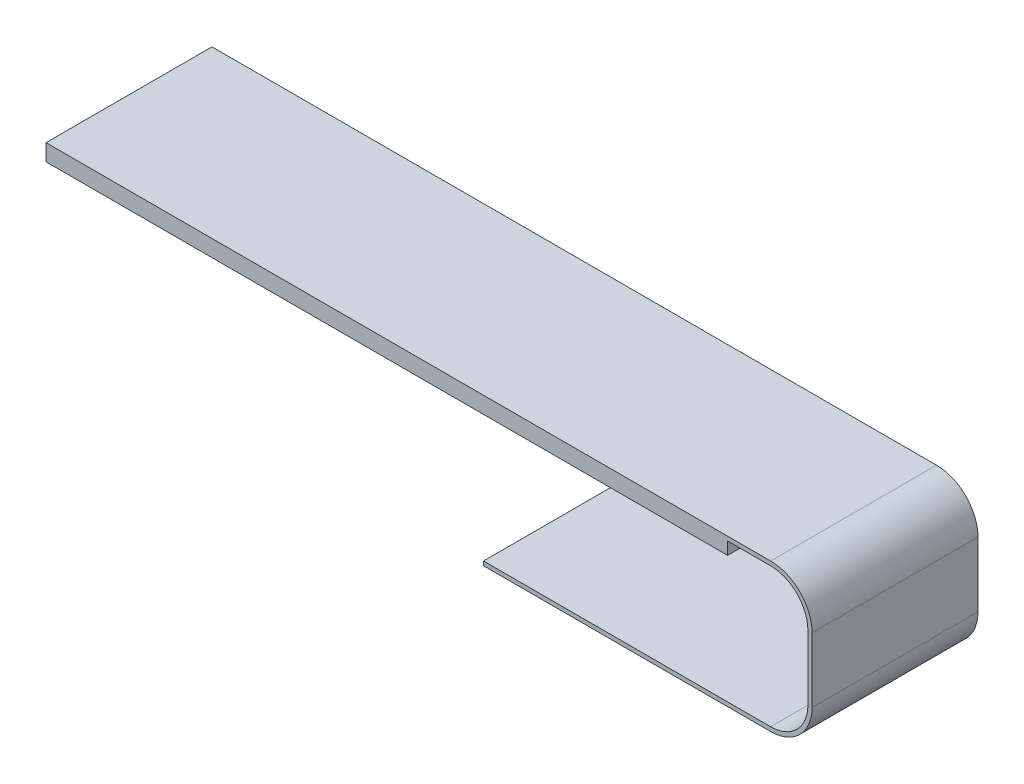
ISO-10303-21;
HEADER;
FILE_DESCRIPTION(('STEP AP214'),'2;1');
FILE_NAME('part.step','',(''),(''),'','','');
FILE_SCHEMA(('AUTOMOTIVE_DESIGN { 1 0 10303 214 1 1 1 1 }'));
ENDSEC;
DATA;
#1=APPLICATION_CONTEXT('core data for automotive mechanical design processes');
#2=APPLICATION_PROTOCOL_DEFINITION('international standard','automotive_design',2000,#1);
#3=PRODUCT_CONTEXT('',#1,'mechanical');
#4=PRODUCT('Part','Part','',(#3));
#5=PRODUCT_RELATED_PRODUCT_CATEGORY('part','',(#4));
#6=PRODUCT_DEFINITION_FORMATION('','',#4);
#7=PRODUCT_DEFINITION_CONTEXT('part definition',#1,'design');
#8=PRODUCT_DEFINITION('design','',#6,#7);
#9=PRODUCT_DEFINITION_SHAPE('','',#8);
#10=(LENGTH_UNIT() NAMED_UNIT(*) SI_UNIT(.MILLI.,.METRE.));
#11=(NAMED_UNIT(*) PLANE_ANGLE_UNIT() SI_UNIT($,.RADIAN.));
#12=(NAMED_UNIT(*) SI_UNIT($,.STERADIAN.) SOLID_ANGLE_UNIT());
#13=UNCERTAINTY_MEASURE_WITH_UNIT(LENGTH_MEASURE(1.E-05),#10,'distance_accuracy_value','');
#14=(GEOMETRIC_REPRESENTATION_CONTEXT(3) GLOBAL_UNCERTAINTY_ASSIGNED_CONTEXT((#13)) GLOBAL_UNIT_ASSIGNED_CONTEXT((#10,
#11,#12)) REPRESENTATION_CONTEXT('',''));
#15=CARTESIAN_POINT('',(0.,0.,0.));
#16=DIRECTION('',(0.,0.,1.));
#17=DIRECTION('',(1.,0.,0.));
#18=AXIS2_PLACEMENT_3D('',#15,#16,#17);
#19=CARTESIAN_POINT('',(0.,0.,4.));
#20=DIRECTION('',(0.,1.,0.));
#21=DIRECTION('',(-1.,0.,0.));
#22=AXIS2_PLACEMENT_3D('',#19,#20,#21);
#23=PLANE('',#22);
#24=DIRECTION('',(0.,0.,1.));
#25=VECTOR('',#24,1.);
#26=CARTESIAN_POINT('',(16.43,0.,4.));
#27=LINE('',#26,#25);
#28=CARTESIAN_POINT('',(16.43,0.,0.));
#29=VERTEX_POINT('',#28);
#30=CARTESIAN_POINT('',(16.43,0.,4.));
#31=VERTEX_POINT('',#30);
#32=EDGE_CURVE('E353',#29,#31,#27,.T.);
#33=ORIENTED_EDGE('',*,*,#32,.F.);
#34=DIRECTION('',(1.,0.,0.));
#35=VECTOR('',#34,1.);
#36=CARTESIAN_POINT('',(0.,0.,0.));
#37=LINE('',#36,#35);
#38=CARTESIAN_POINT('',(17.465,0.,0.));
#39=VERTEX_POINT('',#38);
#40=EDGE_CURVE('E397',#29,#39,#37,.T.);
#41=ORIENTED_EDGE('',*,*,#40,.T.);
#42=DIRECTION('',(0.,0.,-1.));
#43=VECTOR('',#42,1.);
#44=CARTESIAN_POINT('',(17.465,0.,4.));
#45=LINE('',#44,#43);
#46=CARTESIAN_POINT('',(17.465,0.,4.));
#47=VERTEX_POINT('',#46);
#48=EDGE_CURVE('E11',#47,#39,#45,.T.);
#49=ORIENTED_EDGE('',*,*,#48,.F.);
#50=DIRECTION('',(1.,0.,0.));
#51=VECTOR('',#50,1.);
#52=CARTESIAN_POINT('',(0.,0.,4.));
#53=LINE('',#52,#51);
#54=EDGE_CURVE('E372',#31,#47,#53,.T.);
#55=ORIENTED_EDGE('',*,*,#54,.F.);
#56=EDGE_LOOP('',(#33,#41,#49,#55));
#57=FACE_BOUND('',#56,.T.);
#58=ADVANCED_FACE('F34',(#57),#23,.F.);
#59=CARTESIAN_POINT('',(0.,0.,4.));
#60=DIRECTION('',(1.,0.,0.));
#61=DIRECTION('',(0.,0.,-1.));
#62=AXIS2_PLACEMENT_3D('',#59,#60,#61);
#63=PLANE('',#62);
#64=DIRECTION('',(0.,-1.,0.));
#65=VECTOR('',#64,1.);
#66=CARTESIAN_POINT('',(0.,0.,0.));
#67=LINE('',#66,#65);
#68=CARTESIAN_POINT('',(0.,0.1,0.));
#69=VERTEX_POINT('',#68);
#70=CARTESIAN_POINT('',(0.,-0.3,0.));
#71=VERTEX_POINT('',#70);
#72=EDGE_CURVE('E369',#69,#71,#67,.T.);
#73=ORIENTED_EDGE('',*,*,#72,.T.);
#74=DIRECTION('',(0.,0.,-1.));
#75=VECTOR('',#74,1.);
#76=CARTESIAN_POINT('',(0.,-0.3,4.));
#77=LINE('',#76,#75);
#78=CARTESIAN_POINT('',(0.,-0.3,4.));
#79=VERTEX_POINT('',#78);
#80=EDGE_CURVE('E349',#79,#71,#77,.T.);
#81=ORIENTED_EDGE('',*,*,#80,.F.);
#82=DIRECTION('',(0.,-1.,0.));
#83=VECTOR('',#82,1.);
#84=CARTESIAN_POINT('',(0.,0.,4.));
#85=LINE('',#84,#83);
#86=CARTESIAN_POINT('',(0.,0.1,4.));
#87=VERTEX_POINT('',#86);
#88=EDGE_CURVE('E370',#87,#79,#85,.T.);
#89=ORIENTED_EDGE('',*,*,#88,.F.);
#90=DIRECTION('',(0.,0.,-1.));
#91=VECTOR('',#90,1.);
#92=CARTESIAN_POINT('',(0.,0.1,4.));
#93=LINE('',#92,#91);
#94=EDGE_CURVE('E395',#87,#69,#93,.T.);
#95=ORIENTED_EDGE('',*,*,#94,.T.);
#96=EDGE_LOOP('',(#73,#81,#89,#95));
#97=FACE_BOUND('',#96,.T.);
#98=ADVANCED_FACE('F36',(#97),#63,.F.);
#99=CARTESIAN_POINT('',(17.465,-0.9,4.));
#100=DIRECTION('',(0.,0.,-1.));
#101=DIRECTION('',(-1.,0.,0.));
#102=AXIS2_PLACEMENT_3D('',#99,#100,#101);
#103=CYLINDRICAL_SURFACE('',#102,0.900000000000001);
#104=CARTESIAN_POINT('',(17.465,-0.9,0.));
#105=DIRECTION('',(0.,0.,-1.));
#106=DIRECTION('',(-1.,0.,0.));
#107=AXIS2_PLACEMENT_3D('',#104,#105,#106);
#108=CIRCLE('',#107,0.900000000000001);
#109=CARTESIAN_POINT('',(18.365,-0.900000000000023,0.));
#110=VERTEX_POINT('',#109);
#111=EDGE_CURVE('E399',#39,#110,#108,.T.);
#112=ORIENTED_EDGE('',*,*,#111,.T.);
#113=DIRECTION('',(0.,0.,-1.));
#114=VECTOR('',#113,1.);
#115=CARTESIAN_POINT('',(18.365,-0.900000000000023,4.));
#116=LINE('',#115,#114);
#117=CARTESIAN_POINT('',(18.365,-0.900000000000023,4.));
#118=VERTEX_POINT('',#117);
#119=EDGE_CURVE('E42',#118,#110,#116,.T.);
#120=ORIENTED_EDGE('',*,*,#119,.F.);
#121=CARTESIAN_POINT('',(17.465,-0.9,4.));
#122=DIRECTION('',(0.,0.,-1.));
#123=DIRECTION('',(-1.,0.,0.));
#124=AXIS2_PLACEMENT_3D('',#121,#122,#123);
#125=CIRCLE('',#124,0.900000000000001);
#126=EDGE_CURVE('E375',#47,#118,#125,.T.);
#127=ORIENTED_EDGE('',*,*,#126,.F.);
#128=ORIENTED_EDGE('',*,*,#48,.T.);
#129=EDGE_LOOP('',(#112,#120,#127,#128));
#130=FACE_BOUND('',#129,.T.);
#131=ADVANCED_FACE('F474',(#130),#103,.F.);
#132=CARTESIAN_POINT('',(18.365,-0.900000000000023,4.));
#133=DIRECTION('',(1.,0.,0.));
#134=DIRECTION('',(0.,1.,0.));
#135=AXIS2_PLACEMENT_3D('',#132,#133,#134);
#136=PLANE('',#135);
#137=DIRECTION('',(0.,-1.,0.));
#138=VECTOR('',#137,1.);
#139=CARTESIAN_POINT('',(18.365,-0.900000000000023,0.));
#140=LINE('',#139,#138);
#141=CARTESIAN_POINT('',(18.365,-2.45999999999998,0.));
#142=VERTEX_POINT('',#141);
#143=EDGE_CURVE('E401',#110,#142,#140,.T.);
#144=ORIENTED_EDGE('',*,*,#143,.T.);
#145=DIRECTION('',(0.,0.,-1.));
#146=VECTOR('',#145,1.);
#147=CARTESIAN_POINT('',(18.365,-2.45999999999998,4.));
#148=LINE('',#147,#146);
#149=CARTESIAN_POINT('',(18.365,-2.45999999999998,4.));
#150=VERTEX_POINT('',#149);
#151=EDGE_CURVE('E443',#150,#142,#148,.T.);
#152=ORIENTED_EDGE('',*,*,#151,.F.);
#153=DIRECTION('',(0.,-1.,0.));
#154=VECTOR('',#153,1.);
#155=CARTESIAN_POINT('',(18.365,-0.900000000000023,4.));
#156=LINE('',#155,#154);
#157=EDGE_CURVE('E377',#118,#150,#156,.T.);
#158=ORIENTED_EDGE('',*,*,#157,.F.);
#159=ORIENTED_EDGE('',*,*,#119,.T.);
#160=EDGE_LOOP('',(#144,#152,#158,#159));
#161=FACE_BOUND('',#160,.T.);
#162=ADVANCED_FACE('F450',(#161),#136,.F.);
#163=CARTESIAN_POINT('',(17.465,-2.46,4.));
#164=DIRECTION('',(0.,0.,-1.));
#165=DIRECTION('',(-1.,0.,0.));
#166=AXIS2_PLACEMENT_3D('',#163,#164,#165);
#167=CYLINDRICAL_SURFACE('',#166,0.900000000000001);
#168=CARTESIAN_POINT('',(17.465,-2.46,0.));
#169=DIRECTION('',(0.,0.,-1.));
#170=DIRECTION('',(1.,0.,0.));
#171=AXIS2_PLACEMENT_3D('',#168,#169,#170);
#172=CIRCLE('',#171,0.900000000000001);
#173=CARTESIAN_POINT('',(17.465,-3.36,0.));
#174=VERTEX_POINT('',#173);
#175=EDGE_CURVE('E403',#142,#174,#172,.T.);
#176=ORIENTED_EDGE('',*,*,#175,.T.);
#177=DIRECTION('',(0.,0.,-1.));
#178=VECTOR('',#177,1.);
#179=CARTESIAN_POINT('',(17.465,-3.36,4.));
#180=LINE('',#179,#178);
#181=CARTESIAN_POINT('',(17.465,-3.36,4.));
#182=VERTEX_POINT('',#181);
#183=EDGE_CURVE('E440',#182,#174,#180,.T.);
#184=ORIENTED_EDGE('',*,*,#183,.F.);
#185=CARTESIAN_POINT('',(17.465,-2.46,4.));
#186=DIRECTION('',(0.,0.,-1.));
#187=DIRECTION('',(1.,0.,0.));
#188=AXIS2_PLACEMENT_3D('',#185,#186,#187);
#189=CIRCLE('',#188,0.900000000000001);
#190=EDGE_CURVE('E379',#150,#182,#189,.T.);
#191=ORIENTED_EDGE('',*,*,#190,.F.);
#192=ORIENTED_EDGE('',*,*,#151,.T.);
#193=EDGE_LOOP('',(#176,#184,#191,#192));
#194=FACE_BOUND('',#193,.T.);
#195=ADVANCED_FACE('F463',(#194),#167,.F.);
#196=CARTESIAN_POINT('',(17.465,-3.36,4.));
#197=DIRECTION('',(0.,-1.,0.));
#198=DIRECTION('',(1.,0.,0.));
#199=AXIS2_PLACEMENT_3D('',#196,#197,#198);
#200=PLANE('',#199);
#201=DIRECTION('',(-1.,0.,0.));
#202=VECTOR('',#201,1.);
#203=CARTESIAN_POINT('',(17.465,-3.36,0.));
#204=LINE('',#203,#202);
#205=CARTESIAN_POINT('',(10.545,-3.36,0.));
#206=VERTEX_POINT('',#205);
#207=EDGE_CURVE('E405',#174,#206,#204,.T.);
#208=ORIENTED_EDGE('',*,*,#207,.T.);
#209=DIRECTION('',(0.,0.,-1.));
#210=VECTOR('',#209,1.);
#211=CARTESIAN_POINT('',(10.545,-3.36,4.));
#212=LINE('',#211,#210);
#213=CARTESIAN_POINT('',(10.545,-3.36,4.));
#214=VERTEX_POINT('',#213);
#215=EDGE_CURVE('E437',#214,#206,#212,.T.);
#216=ORIENTED_EDGE('',*,*,#215,.F.);
#217=DIRECTION('',(-1.,0.,0.));
#218=VECTOR('',#217,1.);
#219=CARTESIAN_POINT('',(17.465,-3.36,4.));
#220=LINE('',#219,#218);
#221=EDGE_CURVE('E381',#182,#214,#220,.T.);
#222=ORIENTED_EDGE('',*,*,#221,.F.);
#223=ORIENTED_EDGE('',*,*,#183,.T.);
#224=EDGE_LOOP('',(#208,#216,#222,#223));
#225=FACE_BOUND('',#224,.T.);
#226=ADVANCED_FACE('F467',(#225),#200,.F.);
#227=CARTESIAN_POINT('',(10.545,-3.36,4.));
#228=DIRECTION('',(1.,0.,0.));
#229=DIRECTION('',(0.,0.,-1.));
#230=AXIS2_PLACEMENT_3D('',#227,#228,#229);
#231=PLANE('',#230);
#232=DIRECTION('',(0.,0.,-1.));
#233=VECTOR('',#232,1.);
#234=CARTESIAN_POINT('',(10.545,-3.44,3.67898269854774));
#235=LINE('',#234,#233);
#236=CARTESIAN_POINT('',(10.545,-3.44,3.67898269854774));
#237=VERTEX_POINT('',#236);
#238=CARTESIAN_POINT('',(10.545,-3.44,3.11101730145226));
#239=VERTEX_POINT('',#238);
#240=EDGE_CURVE('E244',#237,#239,#235,.T.);
#241=ORIENTED_EDGE('',*,*,#240,.F.);
#242=DIRECTION('',(0.,-1.,0.));
#243=VECTOR('',#242,1.);
#244=CARTESIAN_POINT('',(10.545,-3.44,3.67898269854774));
#245=LINE('',#244,#243);
#246=CARTESIAN_POINT('',(10.545,-3.46,3.67898269854774));
#247=VERTEX_POINT('',#246);
#248=EDGE_CURVE('E363',#237,#247,#245,.T.);
#249=ORIENTED_EDGE('',*,*,#248,.T.);
#250=DIRECTION('',(0.,0.,-1.));
#251=VECTOR('',#250,1.);
#252=CARTESIAN_POINT('',(10.545,-3.46,4.));
#253=LINE('',#252,#251);
#254=CARTESIAN_POINT('',(10.545,-3.46,4.));
#255=VERTEX_POINT('',#254);
#256=EDGE_CURVE('E434',#255,#247,#253,.T.);
#257=ORIENTED_EDGE('',*,*,#256,.F.);
#258=DIRECTION('',(0.,-1.,0.));
#259=VECTOR('',#258,1.);
#260=CARTESIAN_POINT('',(10.545,-3.36,4.));
#261=LINE('',#260,#259);
#262=EDGE_CURVE('E383',#214,#255,#261,.T.);
#263=ORIENTED_EDGE('',*,*,#262,.F.);
#264=ORIENTED_EDGE('',*,*,#215,.T.);
#265=DIRECTION('',(0.,-1.,0.));
#266=VECTOR('',#265,1.);
#267=CARTESIAN_POINT('',(10.545,-3.36,0.));
#268=LINE('',#267,#266);
#269=CARTESIAN_POINT('',(10.545,-3.46,0.));
#270=VERTEX_POINT('',#269);
#271=EDGE_CURVE('E407',#206,#270,#268,.T.);
#272=ORIENTED_EDGE('',*,*,#271,.T.);
#273=CARTESIAN_POINT('',(10.545,-3.46,0.32101730145226));
#274=VERTEX_POINT('',#273);
#275=EDGE_CURVE('E433',#274,#270,#253,.T.);
#276=ORIENTED_EDGE('',*,*,#275,.F.);
#277=DIRECTION('',(0.,-1.,0.));
#278=VECTOR('',#277,1.);
#279=CARTESIAN_POINT('',(10.545,-3.44,0.32101730145226));
#280=LINE('',#279,#278);
#281=CARTESIAN_POINT('',(10.545,-3.44,0.32101730145226));
#282=VERTEX_POINT('',#281);
#283=EDGE_CURVE('E49',#282,#274,#280,.T.);
#284=ORIENTED_EDGE('',*,*,#283,.F.);
#285=DIRECTION('',(0.,0.,-1.));
#286=VECTOR('',#285,1.);
#287=CARTESIAN_POINT('',(10.545,-3.44,0.88898269854774));
#288=LINE('',#287,#286);
#289=CARTESIAN_POINT('',(10.545,-3.44,0.88898269854774));
#290=VERTEX_POINT('',#289);
#291=EDGE_CURVE('E326',#290,#282,#288,.T.);
#292=ORIENTED_EDGE('',*,*,#291,.F.);
#293=DIRECTION('',(0.,-1.,0.));
#294=VECTOR('',#293,1.);
#295=CARTESIAN_POINT('',(10.545,-3.44,0.88898269854774));
#296=LINE('',#295,#294);
#297=CARTESIAN_POINT('',(10.545,-3.46,0.88898269854774));
#298=VERTEX_POINT('',#297);
#299=EDGE_CURVE('E336',#290,#298,#296,.T.);
#300=ORIENTED_EDGE('',*,*,#299,.T.);
#301=CARTESIAN_POINT('',(10.545,-3.46,1.25101730145226));
#302=VERTEX_POINT('',#301);
#303=EDGE_CURVE('E516',#302,#298,#253,.T.);
#304=ORIENTED_EDGE('',*,*,#303,.F.);
#305=DIRECTION('',(0.,-1.,0.));
#306=VECTOR('',#305,1.);
#307=CARTESIAN_POINT('',(10.545,-3.44,1.25101730145226));
#308=LINE('',#307,#306);
#309=CARTESIAN_POINT('',(10.545,-3.44,1.25101730145226));
#310=VERTEX_POINT('',#309);
#311=EDGE_CURVE('E57',#310,#302,#308,.T.);
#312=ORIENTED_EDGE('',*,*,#311,.F.);
#313=DIRECTION('',(0.,0.,-1.));
#314=VECTOR('',#313,1.);
#315=CARTESIAN_POINT('',(10.545,-3.44,1.81898269854774));
#316=LINE('',#315,#314);
#317=CARTESIAN_POINT('',(10.545,-3.44,1.81898269854774));
#318=VERTEX_POINT('',#317);
#319=EDGE_CURVE('E299',#318,#310,#316,.T.);
#320=ORIENTED_EDGE('',*,*,#319,.F.);
#321=DIRECTION('',(0.,-1.,0.));
#322=VECTOR('',#321,1.);
#323=CARTESIAN_POINT('',(10.545,-3.44,1.81898269854774));
#324=LINE('',#323,#322);
#325=CARTESIAN_POINT('',(10.545,-3.46,1.81898269854774));
#326=VERTEX_POINT('',#325);
#327=EDGE_CURVE('E309',#318,#326,#324,.T.);
#328=ORIENTED_EDGE('',*,*,#327,.T.);
#329=CARTESIAN_POINT('',(10.545,-3.46,2.18101730145226));
#330=VERTEX_POINT('',#329);
#331=EDGE_CURVE('E532',#330,#326,#253,.T.);
#332=ORIENTED_EDGE('',*,*,#331,.F.);
#333=DIRECTION('',(0.,-1.,0.));
#334=VECTOR('',#333,1.);
#335=CARTESIAN_POINT('',(10.545,-3.44,2.18101730145226));
#336=LINE('',#335,#334);
#337=CARTESIAN_POINT('',(10.545,-3.44,2.18101730145226));
#338=VERTEX_POINT('',#337);
#339=EDGE_CURVE('E293',#338,#330,#336,.T.);
#340=ORIENTED_EDGE('',*,*,#339,.F.);
#341=DIRECTION('',(0.,0.,-1.));
#342=VECTOR('',#341,1.);
#343=CARTESIAN_POINT('',(10.545,-3.44,2.74898269854774));
#344=LINE('',#343,#342);
#345=CARTESIAN_POINT('',(10.545,-3.44,2.74898269854774));
#346=VERTEX_POINT('',#345);
#347=EDGE_CURVE('E269',#346,#338,#344,.T.);
#348=ORIENTED_EDGE('',*,*,#347,.F.);
#349=DIRECTION('',(0.,-1.,0.));
#350=VECTOR('',#349,1.);
#351=CARTESIAN_POINT('',(10.545,-3.44,2.74898269854774));
#352=LINE('',#351,#350);
#353=CARTESIAN_POINT('',(10.545,-3.46,2.74898269854774));
#354=VERTEX_POINT('',#353);
#355=EDGE_CURVE('E279',#346,#354,#352,.T.);
#356=ORIENTED_EDGE('',*,*,#355,.T.);
#357=CARTESIAN_POINT('',(10.545,-3.46,3.11101730145226));
#358=VERTEX_POINT('',#357);
#359=EDGE_CURVE('E259',#358,#354,#253,.T.);
#360=ORIENTED_EDGE('',*,*,#359,.F.);
#361=DIRECTION('',(0.,-1.,0.));
#362=VECTOR('',#361,1.);
#363=CARTESIAN_POINT('',(10.545,-3.44,3.11101730145226));
#364=LINE('',#363,#362);
#365=EDGE_CURVE('E237',#239,#358,#364,.T.);
#366=ORIENTED_EDGE('',*,*,#365,.F.);
#367=EDGE_LOOP('',(#241,#249,#257,#263,#264,#272,#276,#284,#292,#300,#304,#312,#320,#328,#332,
#340,#348,#356,#360,#366));
#368=FACE_BOUND('',#367,.T.);
#369=ADVANCED_FACE('F256',(#368),#231,.F.);
#370=CARTESIAN_POINT('',(17.4649999943489,-3.46,4.));
#371=DIRECTION('',(0.,1.,0.));
#372=DIRECTION('',(-1.,0.,0.));
#373=AXIS2_PLACEMENT_3D('',#370,#371,#372);
#374=PLANE('',#373);
#375=ORIENTED_EDGE('',*,*,#256,.T.);
#376=DIRECTION('',(-1.,0.,0.));
#377=VECTOR('',#376,1.);
#378=CARTESIAN_POINT('',(10.545,-3.46,3.67898269854774));
#379=LINE('',#378,#377);
#380=CARTESIAN_POINT('',(12.1713938037539,-3.46,3.67898269854774));
#381=VERTEX_POINT('',#380);
#382=EDGE_CURVE('E253',#381,#247,#379,.T.);
#383=ORIENTED_EDGE('',*,*,#382,.F.);
#384=DIRECTION('',(0.,0.,1.));
#385=VECTOR('',#384,1.);
#386=CARTESIAN_POINT('',(12.1713938037539,-3.46,3.67898269854774));
#387=LINE('',#386,#385);
#388=CARTESIAN_POINT('',(12.1713938037539,-3.46,3.11101730145226));
#389=VERTEX_POINT('',#388);
#390=EDGE_CURVE('E520',#389,#381,#387,.T.);
#391=ORIENTED_EDGE('',*,*,#390,.F.);
#392=DIRECTION('',(1.,0.,0.));
#393=VECTOR('',#392,1.);
#394=CARTESIAN_POINT('',(10.545,-3.46,3.11101730145226));
#395=LINE('',#394,#393);
#396=EDGE_CURVE('E290',#358,#389,#395,.T.);
#397=ORIENTED_EDGE('',*,*,#396,.F.);
#398=ORIENTED_EDGE('',*,*,#359,.T.);
#399=DIRECTION('',(-1.,0.,0.));
#400=VECTOR('',#399,1.);
#401=CARTESIAN_POINT('',(10.545,-3.46,2.74898269854774));
#402=LINE('',#401,#400);
#403=CARTESIAN_POINT('',(12.1713938037539,-3.46,2.74898269854774));
#404=VERTEX_POINT('',#403);
#405=EDGE_CURVE('E280',#404,#354,#402,.T.);
#406=ORIENTED_EDGE('',*,*,#405,.F.);
#407=DIRECTION('',(0.,0.,1.));
#408=VECTOR('',#407,1.);
#409=CARTESIAN_POINT('',(12.1713938037539,-3.46,2.74898269854774));
#410=LINE('',#409,#408);
#411=CARTESIAN_POINT('',(12.1713938037539,-3.46,2.18101730145226));
#412=VERTEX_POINT('',#411);
#413=EDGE_CURVE('E270',#412,#404,#410,.T.);
#414=ORIENTED_EDGE('',*,*,#413,.F.);
#415=DIRECTION('',(1.,0.,0.));
#416=VECTOR('',#415,1.);
#417=CARTESIAN_POINT('',(10.545,-3.46,2.18101730145226));
#418=LINE('',#417,#416);
#419=EDGE_CURVE('E282',#330,#412,#418,.T.);
#420=ORIENTED_EDGE('',*,*,#419,.F.);
#421=ORIENTED_EDGE('',*,*,#331,.T.);
#422=DIRECTION('',(-1.,0.,0.));
#423=VECTOR('',#422,1.);
#424=CARTESIAN_POINT('',(10.545,-3.46,1.81898269854774));
#425=LINE('',#424,#423);
#426=CARTESIAN_POINT('',(12.1713938037539,-3.46,1.81898269854774));
#427=VERTEX_POINT('',#426);
#428=EDGE_CURVE('E310',#427,#326,#425,.T.);
#429=ORIENTED_EDGE('',*,*,#428,.F.);
#430=DIRECTION('',(0.,0.,1.));
#431=VECTOR('',#430,1.);
#432=CARTESIAN_POINT('',(12.1713938037539,-3.46,1.81898269854774));
#433=LINE('',#432,#431);
#434=CARTESIAN_POINT('',(12.1713938037539,-3.46,1.25101730145226));
#435=VERTEX_POINT('',#434);
#436=EDGE_CURVE('E300',#435,#427,#433,.T.);
#437=ORIENTED_EDGE('',*,*,#436,.F.);
#438=DIRECTION('',(1.,0.,0.));
#439=VECTOR('',#438,1.);
#440=CARTESIAN_POINT('',(10.545,-3.46,1.25101730145226));
#441=LINE('',#440,#439);
#442=EDGE_CURVE('E312',#302,#435,#441,.T.);
#443=ORIENTED_EDGE('',*,*,#442,.F.);
#444=ORIENTED_EDGE('',*,*,#303,.T.);
#445=DIRECTION('',(-1.,0.,0.));
#446=VECTOR('',#445,1.);
#447=CARTESIAN_POINT('',(10.545,-3.46,0.88898269854774));
#448=LINE('',#447,#446);
#449=CARTESIAN_POINT('',(12.1713938037539,-3.46,0.88898269854774));
#450=VERTEX_POINT('',#449);
#451=EDGE_CURVE('E337',#450,#298,#448,.T.);
#452=ORIENTED_EDGE('',*,*,#451,.F.);
#453=DIRECTION('',(0.,0.,1.));
#454=VECTOR('',#453,1.);
#455=CARTESIAN_POINT('',(12.1713938037539,-3.46,0.88898269854774));
#456=LINE('',#455,#454);
#457=CARTESIAN_POINT('',(12.1713938037539,-3.46,0.32101730145226));
#458=VERTEX_POINT('',#457);
#459=EDGE_CURVE('E327',#458,#450,#456,.T.);
#460=ORIENTED_EDGE('',*,*,#459,.F.);
#461=DIRECTION('',(1.,0.,0.));
#462=VECTOR('',#461,1.);
#463=CARTESIAN_POINT('',(10.545,-3.46,0.32101730145226));
#464=LINE('',#463,#462);
#465=EDGE_CURVE('E339',#274,#458,#464,.T.);
#466=ORIENTED_EDGE('',*,*,#465,.F.);
#467=ORIENTED_EDGE('',*,*,#275,.T.);
#468=DIRECTION('',(1.,0.,0.));
#469=VECTOR('',#468,1.);
#470=CARTESIAN_POINT('',(17.4649999943489,-3.46,0.));
#471=LINE('',#470,#469);
#472=CARTESIAN_POINT('',(17.4649999943489,-3.46,0.));
#473=VERTEX_POINT('',#472);
#474=EDGE_CURVE('E410',#270,#473,#471,.T.);
#475=ORIENTED_EDGE('',*,*,#474,.T.);
#476=DIRECTION('',(0.,0.,-1.));
#477=VECTOR('',#476,1.);
#478=CARTESIAN_POINT('',(17.4649999943489,-3.46,4.));
#479=LINE('',#478,#477);
#480=CARTESIAN_POINT('',(17.4649999943489,-3.46,4.));
#481=VERTEX_POINT('',#480);
#482=EDGE_CURVE('E430',#481,#473,#479,.T.);
#483=ORIENTED_EDGE('',*,*,#482,.F.);
#484=DIRECTION('',(1.,0.,0.));
#485=VECTOR('',#484,1.);
#486=CARTESIAN_POINT('',(17.4649999943489,-3.46,4.));
#487=LINE('',#486,#485);
#488=EDGE_CURVE('E385',#255,#481,#487,.T.);
#489=ORIENTED_EDGE('',*,*,#488,.F.);
#490=EDGE_LOOP('',(#375,#383,#391,#397,#398,#406,#414,#420,#421,#429,#437,#443,#444,#452,#460,
#466,#467,#475,#483,#489));
#491=FACE_BOUND('',#490,.T.);
#492=ADVANCED_FACE('F513',(#491),#374,.F.);
#493=CARTESIAN_POINT('',(17.465,-2.46,4.));
#494=DIRECTION('',(0.,0.,-1.));
#495=DIRECTION('',(-1.,0.,0.));
#496=AXIS2_PLACEMENT_3D('',#493,#494,#495);
#497=CYLINDRICAL_SURFACE('',#496,0.999999999999999);
#498=CARTESIAN_POINT('',(17.465,-2.46,0.));
#499=DIRECTION('',(0.,0.,1.));
#500=DIRECTION('',(1.,0.,0.));
#501=AXIS2_PLACEMENT_3D('',#498,#499,#500);
#502=CIRCLE('',#501,0.999999999999999);
#503=CARTESIAN_POINT('',(18.465,-2.46,0.));
#504=VERTEX_POINT('',#503);
#505=EDGE_CURVE('E412',#473,#504,#502,.T.);
#506=ORIENTED_EDGE('',*,*,#505,.T.);
#507=DIRECTION('',(0.,0.,-1.));
#508=VECTOR('',#507,1.);
#509=CARTESIAN_POINT('',(18.465,-2.46,4.));
#510=LINE('',#509,#508);
#511=CARTESIAN_POINT('',(18.465,-2.46,4.));
#512=VERTEX_POINT('',#511);
#513=EDGE_CURVE('E427',#512,#504,#510,.T.);
#514=ORIENTED_EDGE('',*,*,#513,.F.);
#515=CARTESIAN_POINT('',(17.465,-2.46,4.));
#516=DIRECTION('',(0.,0.,1.));
#517=DIRECTION('',(1.,0.,0.));
#518=AXIS2_PLACEMENT_3D('',#515,#516,#517);
#519=CIRCLE('',#518,0.999999999999999);
#520=EDGE_CURVE('E387',#481,#512,#519,.T.);
#521=ORIENTED_EDGE('',*,*,#520,.F.);
#522=ORIENTED_EDGE('',*,*,#482,.T.);
#523=EDGE_LOOP('',(#506,#514,#521,#522));
#524=FACE_BOUND('',#523,.T.);
#525=ADVANCED_FACE('F508',(#524),#497,.T.);
#526=CARTESIAN_POINT('',(18.465,-0.9,4.));
#527=DIRECTION('',(-1.,0.,0.));
#528=DIRECTION('',(0.,-1.,0.));
#529=AXIS2_PLACEMENT_3D('',#526,#527,#528);
#530=PLANE('',#529);
#531=DIRECTION('',(0.,1.,0.));
#532=VECTOR('',#531,1.);
#533=CARTESIAN_POINT('',(18.465,-0.9,0.));
#534=LINE('',#533,#532);
#535=CARTESIAN_POINT('',(18.465,-0.9,0.));
#536=VERTEX_POINT('',#535);
#537=EDGE_CURVE('E414',#504,#536,#534,.T.);
#538=ORIENTED_EDGE('',*,*,#537,.T.);
#539=DIRECTION('',(0.,0.,-1.));
#540=VECTOR('',#539,1.);
#541=CARTESIAN_POINT('',(18.465,-0.9,4.));
#542=LINE('',#541,#540);
#543=CARTESIAN_POINT('',(18.465,-0.9,4.));
#544=VERTEX_POINT('',#543);
#545=EDGE_CURVE('E424',#544,#536,#542,.T.);
#546=ORIENTED_EDGE('',*,*,#545,.F.);
#547=DIRECTION('',(0.,1.,0.));
#548=VECTOR('',#547,1.);
#549=CARTESIAN_POINT('',(18.465,-0.9,4.));
#550=LINE('',#549,#548);
#551=EDGE_CURVE('E389',#512,#544,#550,.T.);
#552=ORIENTED_EDGE('',*,*,#551,.F.);
#553=ORIENTED_EDGE('',*,*,#513,.T.);
#554=EDGE_LOOP('',(#538,#546,#552,#553));
#555=FACE_BOUND('',#554,.T.);
#556=ADVANCED_FACE('F503',(#555),#530,.F.);
#557=CARTESIAN_POINT('',(17.465,-0.9,4.));
#558=DIRECTION('',(0.,0.,-1.));
#559=DIRECTION('',(-1.,0.,0.));
#560=AXIS2_PLACEMENT_3D('',#557,#558,#559);
#561=CYLINDRICAL_SURFACE('',#560,1.);
#562=CARTESIAN_POINT('',(17.465,-0.9,0.));
#563=DIRECTION('',(0.,0.,1.));
#564=DIRECTION('',(-1.,0.,0.));
#565=AXIS2_PLACEMENT_3D('',#562,#563,#564);
#566=CIRCLE('',#565,1.);
#567=CARTESIAN_POINT('',(17.465,0.1,0.));
#568=VERTEX_POINT('',#567);
#569=EDGE_CURVE('E416',#536,#568,#566,.T.);
#570=ORIENTED_EDGE('',*,*,#569,.T.);
#571=DIRECTION('',(0.,0.,-1.));
#572=VECTOR('',#571,1.);
#573=CARTESIAN_POINT('',(17.465,0.1,4.));
#574=LINE('',#573,#572);
#575=CARTESIAN_POINT('',(17.465,0.1,4.));
#576=VERTEX_POINT('',#575);
#577=EDGE_CURVE('E421',#576,#568,#574,.T.);
#578=ORIENTED_EDGE('',*,*,#577,.F.);
#579=CARTESIAN_POINT('',(17.465,-0.9,4.));
#580=DIRECTION('',(0.,0.,1.));
#581=DIRECTION('',(-1.,0.,0.));
#582=AXIS2_PLACEMENT_3D('',#579,#580,#581);
#583=CIRCLE('',#582,1.);
#584=EDGE_CURVE('E391',#544,#576,#583,.T.);
#585=ORIENTED_EDGE('',*,*,#584,.F.);
#586=ORIENTED_EDGE('',*,*,#545,.T.);
#587=EDGE_LOOP('',(#570,#578,#585,#586));
#588=FACE_BOUND('',#587,.T.);
#589=ADVANCED_FACE('F499',(#588),#561,.T.);
#590=CARTESIAN_POINT('',(0.,0.1,4.));
#591=DIRECTION('',(0.,-1.,0.));
#592=DIRECTION('',(0.,0.,-1.));
#593=AXIS2_PLACEMENT_3D('',#590,#591,#592);
#594=PLANE('',#593);
#595=DIRECTION('',(-1.,0.,0.));
#596=VECTOR('',#595,1.);
#597=CARTESIAN_POINT('',(0.,0.1,0.));
#598=LINE('',#597,#596);
#599=EDGE_CURVE('E373',#568,#69,#598,.T.);
#600=ORIENTED_EDGE('',*,*,#599,.T.);
#601=ORIENTED_EDGE('',*,*,#94,.F.);
#602=DIRECTION('',(-1.,0.,0.));
#603=VECTOR('',#602,1.);
#604=CARTESIAN_POINT('',(0.,0.1,4.));
#605=LINE('',#604,#603);
#606=EDGE_CURVE('E393',#576,#87,#605,.T.);
#607=ORIENTED_EDGE('',*,*,#606,.F.);
#608=ORIENTED_EDGE('',*,*,#577,.T.);
#609=EDGE_LOOP('',(#600,#601,#607,#608));
#610=FACE_BOUND('',#609,.T.);
#611=ADVANCED_FACE('F494',(#610),#594,.F.);
#612=CARTESIAN_POINT('',(17.465,-0.9,4.));
#613=DIRECTION('',(0.,0.,-1.));
#614=DIRECTION('',(-1.,0.,0.));
#615=AXIS2_PLACEMENT_3D('',#612,#613,#614);
#616=PLANE('',#615);
#617=ORIENTED_EDGE('',*,*,#88,.T.);
#618=DIRECTION('',(-1.,0.,0.));
#619=VECTOR('',#618,1.);
#620=CARTESIAN_POINT('',(0.,-0.3,4.));
#621=LINE('',#620,#619);
#622=CARTESIAN_POINT('',(16.43,-0.3,4.));
#623=VERTEX_POINT('',#622);
#624=EDGE_CURVE('E357',#623,#79,#621,.T.);
#625=ORIENTED_EDGE('',*,*,#624,.F.);
#626=DIRECTION('',(0.,1.,0.));
#627=VECTOR('',#626,1.);
#628=CARTESIAN_POINT('',(16.43,-0.3,4.));
#629=LINE('',#628,#627);
#630=EDGE_CURVE('E360',#623,#31,#629,.T.);
#631=ORIENTED_EDGE('',*,*,#630,.T.);
#632=ORIENTED_EDGE('',*,*,#54,.T.);
#633=ORIENTED_EDGE('',*,*,#126,.T.);
#634=ORIENTED_EDGE('',*,*,#157,.T.);
#635=ORIENTED_EDGE('',*,*,#190,.T.);
#636=ORIENTED_EDGE('',*,*,#221,.T.);
#637=ORIENTED_EDGE('',*,*,#262,.T.);
#638=ORIENTED_EDGE('',*,*,#488,.T.);
#639=ORIENTED_EDGE('',*,*,#520,.T.);
#640=ORIENTED_EDGE('',*,*,#551,.T.);
#641=ORIENTED_EDGE('',*,*,#584,.T.);
#642=ORIENTED_EDGE('',*,*,#606,.T.);
#643=EDGE_LOOP('',(#617,#625,#631,#632,#633,#634,#635,#636,#637,#638,#639,#640,#641,#642));
#644=FACE_BOUND('',#643,.T.);
#645=ADVANCED_FACE('F471',(#644),#616,.F.);
#646=CARTESIAN_POINT('',(17.465,-0.9,0.));
#647=DIRECTION('',(0.,0.,-1.));
#648=DIRECTION('',(-1.,0.,0.));
#649=AXIS2_PLACEMENT_3D('',#646,#647,#648);
#650=PLANE('',#649);
#651=ORIENTED_EDGE('',*,*,#72,.F.);
#652=ORIENTED_EDGE('',*,*,#599,.F.);
#653=ORIENTED_EDGE('',*,*,#569,.F.);
#654=ORIENTED_EDGE('',*,*,#537,.F.);
#655=ORIENTED_EDGE('',*,*,#505,.F.);
#656=ORIENTED_EDGE('',*,*,#474,.F.);
#657=ORIENTED_EDGE('',*,*,#271,.F.);
#658=ORIENTED_EDGE('',*,*,#207,.F.);
#659=ORIENTED_EDGE('',*,*,#175,.F.);
#660=ORIENTED_EDGE('',*,*,#143,.F.);
#661=ORIENTED_EDGE('',*,*,#111,.F.);
#662=ORIENTED_EDGE('',*,*,#40,.F.);
#663=DIRECTION('',(0.,1.,0.));
#664=VECTOR('',#663,1.);
#665=CARTESIAN_POINT('',(16.43,-0.3,0.));
#666=LINE('',#665,#664);
#667=CARTESIAN_POINT('',(16.43,-0.3,0.));
#668=VERTEX_POINT('',#667);
#669=EDGE_CURVE('E366',#668,#29,#666,.T.);
#670=ORIENTED_EDGE('',*,*,#669,.F.);
#671=DIRECTION('',(1.,0.,0.));
#672=VECTOR('',#671,1.);
#673=CARTESIAN_POINT('',(0.,-0.3,0.));
#674=LINE('',#673,#672);
#675=EDGE_CURVE('E352',#71,#668,#674,.T.);
#676=ORIENTED_EDGE('',*,*,#675,.F.);
#677=EDGE_LOOP('',(#651,#652,#653,#654,#655,#656,#657,#658,#659,#660,#661,#662,#670,#676));
#678=FACE_BOUND('',#677,.T.);
#679=ADVANCED_FACE('F458',(#678),#650,.T.);
#680=CARTESIAN_POINT('',(16.43,-0.3,4.));
#681=DIRECTION('',(-1.,0.,0.));
#682=DIRECTION('',(0.,0.,1.));
#683=AXIS2_PLACEMENT_3D('',#680,#681,#682);
#684=PLANE('',#683);
#685=ORIENTED_EDGE('',*,*,#32,.T.);
#686=ORIENTED_EDGE('',*,*,#630,.F.);
#687=DIRECTION('',(0.,0.,1.));
#688=VECTOR('',#687,1.);
#689=CARTESIAN_POINT('',(16.43,-0.3,4.));
#690=LINE('',#689,#688);
#691=EDGE_CURVE('E355',#668,#623,#690,.T.);
#692=ORIENTED_EDGE('',*,*,#691,.F.);
#693=ORIENTED_EDGE('',*,*,#669,.T.);
#694=EDGE_LOOP('',(#685,#686,#692,#693));
#695=FACE_BOUND('',#694,.T.);
#696=ADVANCED_FACE('F482',(#695),#684,.F.);
#697=CARTESIAN_POINT('',(0.,-0.3,0.));
#698=DIRECTION('',(0.,-1.,0.));
#699=DIRECTION('',(0.,0.,-1.));
#700=AXIS2_PLACEMENT_3D('',#697,#698,#699);
#701=PLANE('',#700);
#702=ORIENTED_EDGE('',*,*,#80,.T.);
#703=ORIENTED_EDGE('',*,*,#675,.T.);
#704=ORIENTED_EDGE('',*,*,#691,.T.);
#705=ORIENTED_EDGE('',*,*,#624,.T.);
#706=EDGE_LOOP('',(#702,#703,#704,#705));
#707=FACE_BOUND('',#706,.T.);
#708=ADVANCED_FACE('F485',(#707),#701,.T.);
#709=CARTESIAN_POINT('',(10.545,-3.44,0.88898269854774));
#710=DIRECTION('',(0.,0.,1.));
#711=DIRECTION('',(1.,0.,0.));
#712=AXIS2_PLACEMENT_3D('',#709,#710,#711);
#713=PLANE('',#712);
#714=ORIENTED_EDGE('',*,*,#451,.T.);
#715=ORIENTED_EDGE('',*,*,#299,.F.);
#716=DIRECTION('',(-1.,0.,0.));
#717=VECTOR('',#716,1.);
#718=CARTESIAN_POINT('',(10.545,-3.44,0.88898269854774));
#719=LINE('',#718,#717);
#720=CARTESIAN_POINT('',(12.1713938037539,-3.44,0.88898269854774));
#721=VERTEX_POINT('',#720);
#722=EDGE_CURVE('E323',#721,#290,#719,.T.);
#723=ORIENTED_EDGE('',*,*,#722,.F.);
#724=DIRECTION('',(0.,-1.,0.));
#725=VECTOR('',#724,1.);
#726=CARTESIAN_POINT('',(12.1713938037539,-3.44,0.88898269854774));
#727=LINE('',#726,#725);
#728=EDGE_CURVE('E313',#721,#450,#727,.T.);
#729=ORIENTED_EDGE('',*,*,#728,.T.);
#730=EDGE_LOOP('',(#714,#715,#723,#729));
#731=FACE_BOUND('',#730,.T.);
#732=ADVANCED_FACE('F545',(#731),#713,.F.);
#733=CARTESIAN_POINT('',(12.1713938037539,-3.44,0.88898269854774));
#734=DIRECTION('',(1.,0.,0.));
#735=DIRECTION('',(0.,1.,0.));
#736=AXIS2_PLACEMENT_3D('',#733,#734,#735);
#737=PLANE('',#736);
#738=ORIENTED_EDGE('',*,*,#459,.T.);
#739=ORIENTED_EDGE('',*,*,#728,.F.);
#740=DIRECTION('',(0.,0.,1.));
#741=VECTOR('',#740,1.);
#742=CARTESIAN_POINT('',(12.1713938037539,-3.44,0.88898269854774));
#743=LINE('',#742,#741);
#744=CARTESIAN_POINT('',(12.1713938037539,-3.44,0.32101730145226));
#745=VERTEX_POINT('',#744);
#746=EDGE_CURVE('E333',#745,#721,#743,.T.);
#747=ORIENTED_EDGE('',*,*,#746,.F.);
#748=DIRECTION('',(0.,-1.,0.));
#749=VECTOR('',#748,1.);
#750=CARTESIAN_POINT('',(12.1713938037539,-3.44,0.32101730145226));
#751=LINE('',#750,#749);
#752=EDGE_CURVE('E344',#745,#458,#751,.T.);
#753=ORIENTED_EDGE('',*,*,#752,.T.);
#754=EDGE_LOOP('',(#738,#739,#747,#753));
#755=FACE_BOUND('',#754,.T.);
#756=ADVANCED_FACE('F550',(#755),#737,.F.);
#757=CARTESIAN_POINT('',(10.545,-3.44,0.32101730145226));
#758=DIRECTION('',(0.,0.,-1.));
#759=DIRECTION('',(-1.,0.,0.));
#760=AXIS2_PLACEMENT_3D('',#757,#758,#759);
#761=PLANE('',#760);
#762=ORIENTED_EDGE('',*,*,#465,.T.);
#763=ORIENTED_EDGE('',*,*,#752,.F.);
#764=DIRECTION('',(1.,0.,0.));
#765=VECTOR('',#764,1.);
#766=CARTESIAN_POINT('',(10.545,-3.44,0.32101730145226));
#767=LINE('',#766,#765);
#768=EDGE_CURVE('E330',#282,#745,#767,.T.);
#769=ORIENTED_EDGE('',*,*,#768,.F.);
#770=ORIENTED_EDGE('',*,*,#283,.T.);
#771=EDGE_LOOP('',(#762,#763,#769,#770));
#772=FACE_BOUND('',#771,.T.);
#773=ADVANCED_FACE('F551',(#772),#761,.F.);
#774=CARTESIAN_POINT('',(0.,-3.44,0.));
#775=DIRECTION('',(0.,1.,0.));
#776=DIRECTION('',(0.,0.,1.));
#777=AXIS2_PLACEMENT_3D('',#774,#775,#776);
#778=PLANE('',#777);
#779=ORIENTED_EDGE('',*,*,#722,.T.);
#780=ORIENTED_EDGE('',*,*,#291,.T.);
#781=ORIENTED_EDGE('',*,*,#768,.T.);
#782=ORIENTED_EDGE('',*,*,#746,.T.);
#783=EDGE_LOOP('',(#779,#780,#781,#782));
#784=FACE_BOUND('',#783,.T.);
#785=ADVANCED_FACE('F547',(#784),#778,.F.);
#786=CARTESIAN_POINT('',(10.545,-3.44,1.81898269854774));
#787=DIRECTION('',(0.,0.,1.));
#788=DIRECTION('',(1.,0.,0.));
#789=AXIS2_PLACEMENT_3D('',#786,#787,#788);
#790=PLANE('',#789);
#791=ORIENTED_EDGE('',*,*,#428,.T.);
#792=ORIENTED_EDGE('',*,*,#327,.F.);
#793=DIRECTION('',(-1.,0.,0.));
#794=VECTOR('',#793,1.);
#795=CARTESIAN_POINT('',(10.545,-3.44,1.81898269854774));
#796=LINE('',#795,#794);
#797=CARTESIAN_POINT('',(12.1713938037539,-3.44,1.81898269854774));
#798=VERTEX_POINT('',#797);
#799=EDGE_CURVE('E296',#798,#318,#796,.T.);
#800=ORIENTED_EDGE('',*,*,#799,.F.);
#801=DIRECTION('',(0.,-1.,0.));
#802=VECTOR('',#801,1.);
#803=CARTESIAN_POINT('',(12.1713938037539,-3.44,1.81898269854774));
#804=LINE('',#803,#802);
#805=EDGE_CURVE('E283',#798,#427,#804,.T.);
#806=ORIENTED_EDGE('',*,*,#805,.T.);
#807=EDGE_LOOP('',(#791,#792,#800,#806));
#808=FACE_BOUND('',#807,.T.);
#809=ADVANCED_FACE('F558',(#808),#790,.F.);
#810=CARTESIAN_POINT('',(12.1713938037539,-3.44,1.81898269854774));
#811=DIRECTION('',(1.,0.,0.));
#812=DIRECTION('',(0.,1.,0.));
#813=AXIS2_PLACEMENT_3D('',#810,#811,#812);
#814=PLANE('',#813);
#815=ORIENTED_EDGE('',*,*,#436,.T.);
#816=ORIENTED_EDGE('',*,*,#805,.F.);
#817=DIRECTION('',(0.,0.,1.));
#818=VECTOR('',#817,1.);
#819=CARTESIAN_POINT('',(12.1713938037539,-3.44,1.81898269854774));
#820=LINE('',#819,#818);
#821=CARTESIAN_POINT('',(12.1713938037539,-3.44,1.25101730145226));
#822=VERTEX_POINT('',#821);
#823=EDGE_CURVE('E306',#822,#798,#820,.T.);
#824=ORIENTED_EDGE('',*,*,#823,.F.);
#825=DIRECTION('',(0.,-1.,0.));
#826=VECTOR('',#825,1.);
#827=CARTESIAN_POINT('',(12.1713938037539,-3.44,1.25101730145226));
#828=LINE('',#827,#826);
#829=EDGE_CURVE('E318',#822,#435,#828,.T.);
#830=ORIENTED_EDGE('',*,*,#829,.T.);
#831=EDGE_LOOP('',(#815,#816,#824,#830));
#832=FACE_BOUND('',#831,.T.);
#833=ADVANCED_FACE('F623',(#832),#814,.F.);
#834=CARTESIAN_POINT('',(10.545,-3.44,1.25101730145226));
#835=DIRECTION('',(0.,0.,-1.));
#836=DIRECTION('',(-1.,0.,0.));
#837=AXIS2_PLACEMENT_3D('',#834,#835,#836);
#838=PLANE('',#837);
#839=ORIENTED_EDGE('',*,*,#442,.T.);
#840=ORIENTED_EDGE('',*,*,#829,.F.);
#841=DIRECTION('',(1.,0.,0.));
#842=VECTOR('',#841,1.);
#843=CARTESIAN_POINT('',(10.545,-3.44,1.25101730145226));
#844=LINE('',#843,#842);
#845=EDGE_CURVE('E303',#310,#822,#844,.T.);
#846=ORIENTED_EDGE('',*,*,#845,.F.);
#847=ORIENTED_EDGE('',*,*,#311,.T.);
#848=EDGE_LOOP('',(#839,#840,#846,#847));
#849=FACE_BOUND('',#848,.T.);
#850=ADVANCED_FACE('F633',(#849),#838,.F.);
#851=CARTESIAN_POINT('',(0.,-3.44,0.));
#852=DIRECTION('',(0.,1.,0.));
#853=DIRECTION('',(0.,0.,1.));
#854=AXIS2_PLACEMENT_3D('',#851,#852,#853);
#855=PLANE('',#854);
#856=ORIENTED_EDGE('',*,*,#799,.T.);
#857=ORIENTED_EDGE('',*,*,#319,.T.);
#858=ORIENTED_EDGE('',*,*,#845,.T.);
#859=ORIENTED_EDGE('',*,*,#823,.T.);
#860=EDGE_LOOP('',(#856,#857,#858,#859));
#861=FACE_BOUND('',#860,.T.);
#862=ADVANCED_FACE('F643',(#861),#855,.F.);
#863=CARTESIAN_POINT('',(10.545,-3.44,2.74898269854774));
#864=DIRECTION('',(0.,0.,1.));
#865=DIRECTION('',(1.,0.,0.));
#866=AXIS2_PLACEMENT_3D('',#863,#864,#865);
#867=PLANE('',#866);
#868=ORIENTED_EDGE('',*,*,#405,.T.);
#869=ORIENTED_EDGE('',*,*,#355,.F.);
#870=DIRECTION('',(-1.,0.,0.));
#871=VECTOR('',#870,1.);
#872=CARTESIAN_POINT('',(10.545,-3.44,2.74898269854774));
#873=LINE('',#872,#871);
#874=CARTESIAN_POINT('',(12.1713938037539,-3.44,2.74898269854774));
#875=VERTEX_POINT('',#874);
#876=EDGE_CURVE('E266',#875,#346,#873,.T.);
#877=ORIENTED_EDGE('',*,*,#876,.F.);
#878=DIRECTION('',(0.,-1.,0.));
#879=VECTOR('',#878,1.);
#880=CARTESIAN_POINT('',(12.1713938037539,-3.44,2.74898269854774));
#881=LINE('',#880,#879);
#882=EDGE_CURVE('E288',#875,#404,#881,.T.);
#883=ORIENTED_EDGE('',*,*,#882,.T.);
#884=EDGE_LOOP('',(#868,#869,#877,#883));
#885=FACE_BOUND('',#884,.T.);
#886=ADVANCED_FACE('F652',(#885),#867,.F.);
#887=CARTESIAN_POINT('',(12.1713938037539,-3.44,2.74898269854774));
#888=DIRECTION('',(1.,0.,0.));
#889=DIRECTION('',(0.,1.,0.));
#890=AXIS2_PLACEMENT_3D('',#887,#888,#889);
#891=PLANE('',#890);
#892=ORIENTED_EDGE('',*,*,#413,.T.);
#893=ORIENTED_EDGE('',*,*,#882,.F.);
#894=DIRECTION('',(0.,0.,1.));
#895=VECTOR('',#894,1.);
#896=CARTESIAN_POINT('',(12.1713938037539,-3.44,2.74898269854774));
#897=LINE('',#896,#895);
#898=CARTESIAN_POINT('',(12.1713938037539,-3.44,2.18101730145226));
#899=VERTEX_POINT('',#898);
#900=EDGE_CURVE('E276',#899,#875,#897,.T.);
#901=ORIENTED_EDGE('',*,*,#900,.F.);
#902=DIRECTION('',(0.,-1.,0.));
#903=VECTOR('',#902,1.);
#904=CARTESIAN_POINT('',(12.1713938037539,-3.44,2.18101730145226));
#905=LINE('',#904,#903);
#906=EDGE_CURVE('E291',#899,#412,#905,.T.);
#907=ORIENTED_EDGE('',*,*,#906,.T.);
#908=EDGE_LOOP('',(#892,#893,#901,#907));
#909=FACE_BOUND('',#908,.T.);
#910=ADVANCED_FACE('F662',(#909),#891,.F.);
#911=CARTESIAN_POINT('',(10.545,-3.44,2.18101730145226));
#912=DIRECTION('',(0.,0.,-1.));
#913=DIRECTION('',(-1.,0.,0.));
#914=AXIS2_PLACEMENT_3D('',#911,#912,#913);
#915=PLANE('',#914);
#916=ORIENTED_EDGE('',*,*,#419,.T.);
#917=ORIENTED_EDGE('',*,*,#906,.F.);
#918=DIRECTION('',(1.,0.,0.));
#919=VECTOR('',#918,1.);
#920=CARTESIAN_POINT('',(10.545,-3.44,2.18101730145226));
#921=LINE('',#920,#919);
#922=EDGE_CURVE('E273',#338,#899,#921,.T.);
#923=ORIENTED_EDGE('',*,*,#922,.F.);
#924=ORIENTED_EDGE('',*,*,#339,.T.);
#925=EDGE_LOOP('',(#916,#917,#923,#924));
#926=FACE_BOUND('',#925,.T.);
#927=ADVANCED_FACE('F672',(#926),#915,.F.);
#928=CARTESIAN_POINT('',(0.,-3.44,0.));
#929=DIRECTION('',(0.,1.,0.));
#930=DIRECTION('',(0.,0.,1.));
#931=AXIS2_PLACEMENT_3D('',#928,#929,#930);
#932=PLANE('',#931);
#933=ORIENTED_EDGE('',*,*,#876,.T.);
#934=ORIENTED_EDGE('',*,*,#347,.T.);
#935=ORIENTED_EDGE('',*,*,#922,.T.);
#936=ORIENTED_EDGE('',*,*,#900,.T.);
#937=EDGE_LOOP('',(#933,#934,#935,#936));
#938=FACE_BOUND('',#937,.T.);
#939=ADVANCED_FACE('F682',(#938),#932,.F.);
#940=CARTESIAN_POINT('',(10.545,-3.44,3.67898269854774));
#941=DIRECTION('',(0.,0.,1.));
#942=DIRECTION('',(1.,0.,0.));
#943=AXIS2_PLACEMENT_3D('',#940,#941,#942);
#944=PLANE('',#943);
#945=ORIENTED_EDGE('',*,*,#382,.T.);
#946=ORIENTED_EDGE('',*,*,#248,.F.);
#947=DIRECTION('',(-1.,0.,0.));
#948=VECTOR('',#947,1.);
#949=CARTESIAN_POINT('',(10.545,-3.44,3.67898269854774));
#950=LINE('',#949,#948);
#951=CARTESIAN_POINT('',(12.1713938037539,-3.44,3.67898269854774));
#952=VERTEX_POINT('',#951);
#953=EDGE_CURVE('E250',#952,#237,#950,.T.);
#954=ORIENTED_EDGE('',*,*,#953,.F.);
#955=DIRECTION('',(0.,-1.,0.));
#956=VECTOR('',#955,1.);
#957=CARTESIAN_POINT('',(12.1713938037539,-3.44,3.67898269854774));
#958=LINE('',#957,#956);
#959=EDGE_CURVE('E261',#952,#381,#958,.T.);
#960=ORIENTED_EDGE('',*,*,#959,.T.);
#961=EDGE_LOOP('',(#945,#946,#954,#960));
#962=FACE_BOUND('',#961,.T.);
#963=ADVANCED_FACE('F526',(#962),#944,.F.);
#964=CARTESIAN_POINT('',(12.1713938037539,-3.44,3.67898269854774));
#965=DIRECTION('',(1.,0.,0.));
#966=DIRECTION('',(0.,1.,0.));
#967=AXIS2_PLACEMENT_3D('',#964,#965,#966);
#968=PLANE('',#967);
#969=ORIENTED_EDGE('',*,*,#390,.T.);
#970=ORIENTED_EDGE('',*,*,#959,.F.);
#971=DIRECTION('',(0.,0.,1.));
#972=VECTOR('',#971,1.);
#973=CARTESIAN_POINT('',(12.1713938037539,-3.44,3.67898269854774));
#974=LINE('',#973,#972);
#975=CARTESIAN_POINT('',(12.1713938037539,-3.44,3.11101730145226));
#976=VERTEX_POINT('',#975);
#977=EDGE_CURVE('E243',#976,#952,#974,.T.);
#978=ORIENTED_EDGE('',*,*,#977,.F.);
#979=DIRECTION('',(0.,-1.,0.));
#980=VECTOR('',#979,1.);
#981=CARTESIAN_POINT('',(12.1713938037539,-3.44,3.11101730145226));
#982=LINE('',#981,#980);
#983=EDGE_CURVE('E239',#976,#389,#982,.T.);
#984=ORIENTED_EDGE('',*,*,#983,.T.);
#985=EDGE_LOOP('',(#969,#970,#978,#984));
#986=FACE_BOUND('',#985,.T.);
#987=ADVANCED_FACE('F528',(#986),#968,.F.);
#988=CARTESIAN_POINT('',(10.545,-3.44,3.11101730145226));
#989=DIRECTION('',(0.,0.,-1.));
#990=DIRECTION('',(-1.,0.,0.));
#991=AXIS2_PLACEMENT_3D('',#988,#989,#990);
#992=PLANE('',#991);
#993=ORIENTED_EDGE('',*,*,#396,.T.);
#994=ORIENTED_EDGE('',*,*,#983,.F.);
#995=DIRECTION('',(1.,0.,0.));
#996=VECTOR('',#995,1.);
#997=CARTESIAN_POINT('',(10.545,-3.44,3.11101730145226));
#998=LINE('',#997,#996);
#999=EDGE_CURVE('E232',#239,#976,#998,.T.);
#1000=ORIENTED_EDGE('',*,*,#999,.F.);
#1001=ORIENTED_EDGE('',*,*,#365,.T.);
#1002=EDGE_LOOP('',(#993,#994,#1000,#1001));
#1003=FACE_BOUND('',#1002,.T.);
#1004=ADVANCED_FACE('F235',(#1003),#992,.F.);
#1005=CARTESIAN_POINT('',(0.,-3.44,0.));
#1006=DIRECTION('',(0.,-1.,0.));
#1007=DIRECTION('',(0.,0.,-1.));
#1008=AXIS2_PLACEMENT_3D('',#1005,#1006,#1007);
#1009=PLANE('',#1008);
#1010=ORIENTED_EDGE('',*,*,#240,.T.);
#1011=ORIENTED_EDGE('',*,*,#999,.T.);
#1012=ORIENTED_EDGE('',*,*,#977,.T.);
#1013=ORIENTED_EDGE('',*,*,#953,.T.);
#1014=EDGE_LOOP('',(#1010,#1011,#1012,#1013));
#1015=FACE_BOUND('',#1014,.T.);
#1016=ADVANCED_FACE('F248',(#1015),#1009,.T.);
#1017=CLOSED_SHELL('',(#58,#98,#131,#162,#195,#226,#369,#492,#525,#556,#589,#611,#645,#679,#696,
#708,#732,#756,#773,#785,#809,#833,#850,#862,#886,#910,#927,#939,#963,#987,#1004,#1016));
#1018=MANIFOLD_SOLID_BREP('B2',#1017);
#1019=ADVANCED_BREP_SHAPE_REPRESENTATION('',(#18,#1018),#14);
#1020=SHAPE_DEFINITION_REPRESENTATION(#9,#1019);
ENDSEC;
END-ISO-10303-21;
